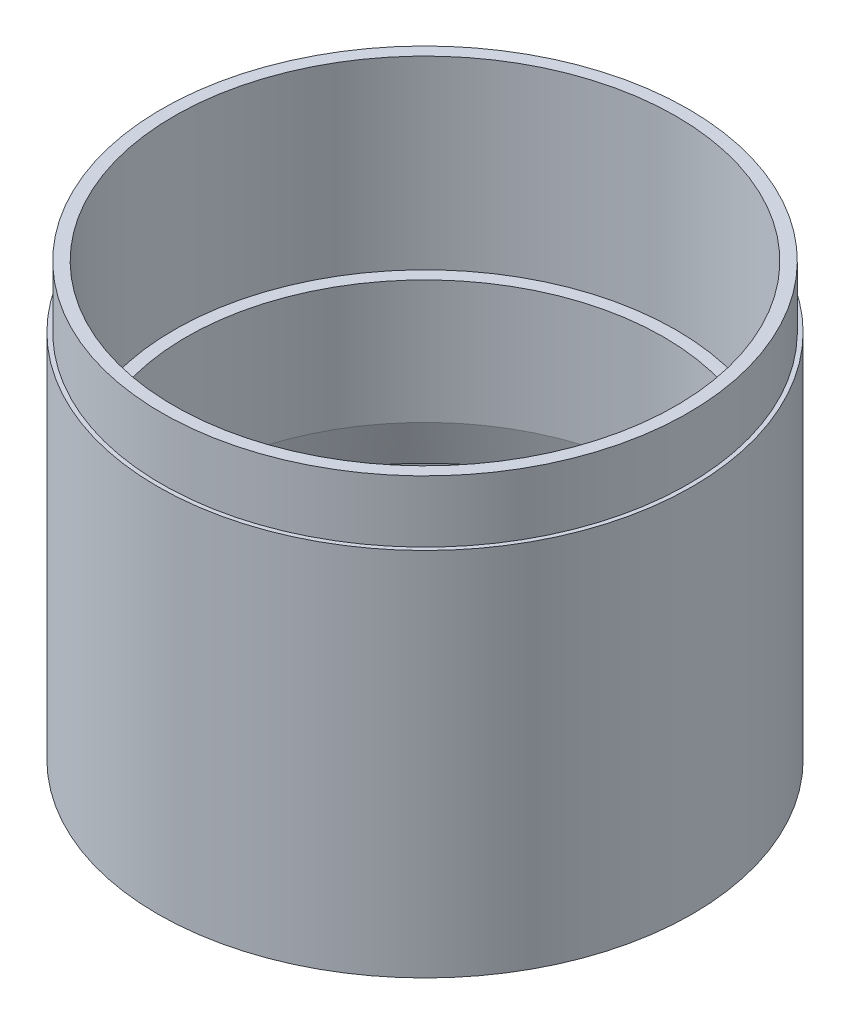
ISO-10303-21;
HEADER;
FILE_DESCRIPTION(('STEP AP214'),'2;1');
FILE_NAME('part.step','',(''),(''),'','','');
FILE_SCHEMA(('AUTOMOTIVE_DESIGN { 1 0 10303 214 1 1 1 1 }'));
ENDSEC;
DATA;
#1=APPLICATION_CONTEXT('core data for automotive mechanical design processes');
#2=APPLICATION_PROTOCOL_DEFINITION('international standard','automotive_design',2000,#1);
#3=PRODUCT_CONTEXT('',#1,'mechanical');
#4=PRODUCT('Part','Part','',(#3));
#5=PRODUCT_RELATED_PRODUCT_CATEGORY('part','',(#4));
#6=PRODUCT_DEFINITION_FORMATION('','',#4);
#7=PRODUCT_DEFINITION_CONTEXT('part definition',#1,'design');
#8=PRODUCT_DEFINITION('design','',#6,#7);
#9=PRODUCT_DEFINITION_SHAPE('','',#8);
#10=(LENGTH_UNIT() NAMED_UNIT(*) SI_UNIT(.MILLI.,.METRE.));
#11=(NAMED_UNIT(*) PLANE_ANGLE_UNIT() SI_UNIT($,.RADIAN.));
#12=(NAMED_UNIT(*) SI_UNIT($,.STERADIAN.) SOLID_ANGLE_UNIT());
#13=UNCERTAINTY_MEASURE_WITH_UNIT(LENGTH_MEASURE(1.E-05),#10,'distance_accuracy_value','');
#14=(GEOMETRIC_REPRESENTATION_CONTEXT(3) GLOBAL_UNCERTAINTY_ASSIGNED_CONTEXT((#13)) GLOBAL_UNIT_ASSIGNED_CONTEXT((#10,
#11,#12)) REPRESENTATION_CONTEXT('',''));
#15=CARTESIAN_POINT('',(0.,0.,0.));
#16=DIRECTION('',(0.,0.,1.));
#17=DIRECTION('',(1.,0.,0.));
#18=AXIS2_PLACEMENT_3D('',#15,#16,#17);
#19=CARTESIAN_POINT('',(0.,20.,0.));
#20=DIRECTION('',(0.,1.,0.));
#21=DIRECTION('',(0.,0.,1.));
#22=AXIS2_PLACEMENT_3D('',#19,#20,#21);
#23=PLANE('',#22);
#24=CARTESIAN_POINT('',(0.,20.,0.));
#25=DIRECTION('',(0.,-1.,0.));
#26=DIRECTION('',(0.,0.,-1.));
#27=AXIS2_PLACEMENT_3D('',#24,#25,#26);
#28=CIRCLE('',#27,60.);
#29=CARTESIAN_POINT('',(0.,20.,-60.));
#30=VERTEX_POINT('',#29);
#31=EDGE_CURVE('E10',#30,#30,#28,.T.);
#32=ORIENTED_EDGE('',*,*,#31,.F.);
#33=EDGE_LOOP('',(#32));
#34=FACE_BOUND('',#33,.T.);
#35=CARTESIAN_POINT('',(0.,20.,0.));
#36=DIRECTION('',(0.,-1.,0.));
#37=DIRECTION('',(0.,0.,-1.));
#38=AXIS2_PLACEMENT_3D('',#35,#36,#37);
#39=CIRCLE('',#38,62.);
#40=CARTESIAN_POINT('',(0.,20.,-62.));
#41=VERTEX_POINT('',#40);
#42=EDGE_CURVE('E88',#41,#41,#39,.T.);
#43=ORIENTED_EDGE('',*,*,#42,.T.);
#44=EDGE_LOOP('',(#43));
#45=FACE_BOUND('',#44,.T.);
#46=ADVANCED_FACE('F41',(#34,#45),#23,.F.);
#47=CARTESIAN_POINT('',(0.,20.,0.));
#48=DIRECTION('',(0.,-1.,0.));
#49=DIRECTION('',(0.,0.,-1.));
#50=AXIS2_PLACEMENT_3D('',#47,#48,#49);
#51=CONICAL_SURFACE('',#50,60.,0.19739555984988);
#52=CARTESIAN_POINT('',(0.,30.,0.));
#53=DIRECTION('',(0.,-1.,0.));
#54=DIRECTION('',(0.,0.,-1.));
#55=AXIS2_PLACEMENT_3D('',#52,#53,#54);
#56=CIRCLE('',#55,58.);
#57=CARTESIAN_POINT('',(0.,30.,-58.));
#58=VERTEX_POINT('',#57);
#59=EDGE_CURVE('E48',#58,#58,#56,.T.);
#60=ORIENTED_EDGE('',*,*,#59,.F.);
#61=EDGE_LOOP('',(#60));
#62=FACE_BOUND('',#61,.T.);
#63=ORIENTED_EDGE('',*,*,#31,.T.);
#64=EDGE_LOOP('',(#63));
#65=FACE_BOUND('',#64,.T.);
#66=ADVANCED_FACE('F106',(#62,#65),#51,.F.);
#67=CARTESIAN_POINT('',(0.,0.,0.));
#68=DIRECTION('',(0.,-1.,0.));
#69=DIRECTION('',(0.,0.,-1.));
#70=AXIS2_PLACEMENT_3D('',#67,#68,#69);
#71=CYLINDRICAL_SURFACE('',#70,58.);
#72=CARTESIAN_POINT('',(0.,60.,0.));
#73=DIRECTION('',(0.,-1.,0.));
#74=DIRECTION('',(0.,0.,-1.));
#75=AXIS2_PLACEMENT_3D('',#72,#73,#74);
#76=CIRCLE('',#75,58.);
#77=CARTESIAN_POINT('',(0.,60.,-58.));
#78=VERTEX_POINT('',#77);
#79=EDGE_CURVE('E53',#78,#78,#76,.T.);
#80=ORIENTED_EDGE('',*,*,#79,.F.);
#81=EDGE_LOOP('',(#80));
#82=FACE_BOUND('',#81,.T.);
#83=ORIENTED_EDGE('',*,*,#59,.T.);
#84=EDGE_LOOP('',(#83));
#85=FACE_BOUND('',#84,.T.);
#86=ADVANCED_FACE('F111',(#82,#85),#71,.F.);
#87=CARTESIAN_POINT('',(-1.38777878078145E-13,60.,0.));
#88=DIRECTION('',(0.,-1.,0.));
#89=DIRECTION('',(0.,0.,-1.));
#90=AXIS2_PLACEMENT_3D('',#87,#88,#89);
#91=PLANE('',#90);
#92=CARTESIAN_POINT('',(0.,60.,0.));
#93=DIRECTION('',(0.,-1.,0.));
#94=DIRECTION('',(0.,0.,-1.));
#95=AXIS2_PLACEMENT_3D('',#92,#93,#94);
#96=CIRCLE('',#95,61.);
#97=CARTESIAN_POINT('',(0.,60.,-61.));
#98=VERTEX_POINT('',#97);
#99=EDGE_CURVE('E58',#98,#98,#96,.T.);
#100=ORIENTED_EDGE('',*,*,#99,.F.);
#101=EDGE_LOOP('',(#100));
#102=FACE_BOUND('',#101,.T.);
#103=ORIENTED_EDGE('',*,*,#79,.T.);
#104=EDGE_LOOP('',(#103));
#105=FACE_BOUND('',#104,.T.);
#106=ADVANCED_FACE('F116',(#102,#105),#91,.F.);
#107=CARTESIAN_POINT('',(0.,0.,0.));
#108=DIRECTION('',(0.,-1.,0.));
#109=DIRECTION('',(0.,0.,-1.));
#110=AXIS2_PLACEMENT_3D('',#107,#108,#109);
#111=CYLINDRICAL_SURFACE('',#110,61.);
#112=CARTESIAN_POINT('',(0.,105.,0.));
#113=DIRECTION('',(0.,-1.,0.));
#114=DIRECTION('',(0.,0.,-1.));
#115=AXIS2_PLACEMENT_3D('',#112,#113,#114);
#116=CIRCLE('',#115,61.);
#117=CARTESIAN_POINT('',(0.,105.,-61.));
#118=VERTEX_POINT('',#117);
#119=EDGE_CURVE('E64',#118,#118,#116,.T.);
#120=ORIENTED_EDGE('',*,*,#119,.F.);
#121=EDGE_LOOP('',(#120));
#122=FACE_BOUND('',#121,.T.);
#123=ORIENTED_EDGE('',*,*,#99,.T.);
#124=EDGE_LOOP('',(#123));
#125=FACE_BOUND('',#124,.T.);
#126=ADVANCED_FACE('F122',(#122,#125),#111,.F.);
#127=CARTESIAN_POINT('',(0.,105.,0.));
#128=DIRECTION('',(0.,1.,0.));
#129=DIRECTION('',(0.,0.,1.));
#130=AXIS2_PLACEMENT_3D('',#127,#128,#129);
#131=PLANE('',#130);
#132=ORIENTED_EDGE('',*,*,#119,.T.);
#133=EDGE_LOOP('',(#132));
#134=FACE_BOUND('',#133,.T.);
#135=CARTESIAN_POINT('',(0.,105.,0.));
#136=DIRECTION('',(0.,-1.,0.));
#137=DIRECTION('',(0.,0.,-1.));
#138=AXIS2_PLACEMENT_3D('',#135,#136,#137);
#139=CIRCLE('',#138,64.);
#140=CARTESIAN_POINT('',(0.,105.,-64.));
#141=VERTEX_POINT('',#140);
#142=EDGE_CURVE('E68',#141,#141,#139,.T.);
#143=ORIENTED_EDGE('',*,*,#142,.F.);
#144=EDGE_LOOP('',(#143));
#145=FACE_BOUND('',#144,.T.);
#146=ADVANCED_FACE('F126',(#134,#145),#131,.T.);
#147=CARTESIAN_POINT('',(0.,0.,0.));
#148=DIRECTION('',(0.,-1.,0.));
#149=DIRECTION('',(0.,0.,-1.));
#150=AXIS2_PLACEMENT_3D('',#147,#148,#149);
#151=CYLINDRICAL_SURFACE('',#150,64.);
#152=ORIENTED_EDGE('',*,*,#142,.T.);
#153=EDGE_LOOP('',(#152));
#154=FACE_BOUND('',#153,.T.);
#155=CARTESIAN_POINT('',(0.,90.,0.));
#156=DIRECTION('',(0.,-1.,0.));
#157=DIRECTION('',(0.,0.,-1.));
#158=AXIS2_PLACEMENT_3D('',#155,#156,#157);
#159=CIRCLE('',#158,64.);
#160=CARTESIAN_POINT('',(0.,90.,-64.));
#161=VERTEX_POINT('',#160);
#162=EDGE_CURVE('E72',#161,#161,#159,.T.);
#163=ORIENTED_EDGE('',*,*,#162,.F.);
#164=EDGE_LOOP('',(#163));
#165=FACE_BOUND('',#164,.T.);
#166=ADVANCED_FACE('F130',(#154,#165),#151,.T.);
#167=CARTESIAN_POINT('',(0.,90.,0.));
#168=DIRECTION('',(0.,1.,0.));
#169=DIRECTION('',(0.,0.,1.));
#170=AXIS2_PLACEMENT_3D('',#167,#168,#169);
#171=PLANE('',#170);
#172=ORIENTED_EDGE('',*,*,#162,.T.);
#173=EDGE_LOOP('',(#172));
#174=FACE_BOUND('',#173,.T.);
#175=CARTESIAN_POINT('',(0.,90.,0.));
#176=DIRECTION('',(0.,-1.,0.));
#177=DIRECTION('',(0.,0.,-1.));
#178=AXIS2_PLACEMENT_3D('',#175,#176,#177);
#179=CIRCLE('',#178,65.);
#180=CARTESIAN_POINT('',(0.,90.,-65.));
#181=VERTEX_POINT('',#180);
#182=EDGE_CURVE('E76',#181,#181,#179,.T.);
#183=ORIENTED_EDGE('',*,*,#182,.F.);
#184=EDGE_LOOP('',(#183));
#185=FACE_BOUND('',#184,.T.);
#186=ADVANCED_FACE('F134',(#174,#185),#171,.T.);
#187=CARTESIAN_POINT('',(0.,0.,0.));
#188=DIRECTION('',(0.,-1.,0.));
#189=DIRECTION('',(0.,0.,-1.));
#190=AXIS2_PLACEMENT_3D('',#187,#188,#189);
#191=CYLINDRICAL_SURFACE('',#190,65.);
#192=ORIENTED_EDGE('',*,*,#182,.T.);
#193=EDGE_LOOP('',(#192));
#194=FACE_BOUND('',#193,.T.);
#195=CARTESIAN_POINT('',(0.,0.,0.));
#196=DIRECTION('',(0.,-1.,0.));
#197=DIRECTION('',(0.,0.,-1.));
#198=AXIS2_PLACEMENT_3D('',#195,#196,#197);
#199=CIRCLE('',#198,65.);
#200=CARTESIAN_POINT('',(0.,0.,-65.));
#201=VERTEX_POINT('',#200);
#202=EDGE_CURVE('E80',#201,#201,#199,.T.);
#203=ORIENTED_EDGE('',*,*,#202,.F.);
#204=EDGE_LOOP('',(#203));
#205=FACE_BOUND('',#204,.T.);
#206=ADVANCED_FACE('F102',(#194,#205),#191,.T.);
#207=CARTESIAN_POINT('',(0.,0.,0.));
#208=DIRECTION('',(0.,-1.,0.));
#209=DIRECTION('',(0.,0.,-1.));
#210=AXIS2_PLACEMENT_3D('',#207,#208,#209);
#211=PLANE('',#210);
#212=ORIENTED_EDGE('',*,*,#202,.T.);
#213=EDGE_LOOP('',(#212));
#214=FACE_BOUND('',#213,.T.);
#215=CARTESIAN_POINT('',(0.,0.,0.));
#216=DIRECTION('',(0.,-1.,0.));
#217=DIRECTION('',(0.,0.,-1.));
#218=AXIS2_PLACEMENT_3D('',#215,#216,#217);
#219=CIRCLE('',#218,62.);
#220=CARTESIAN_POINT('',(0.,0.,-62.));
#221=VERTEX_POINT('',#220);
#222=EDGE_CURVE('E84',#221,#221,#219,.T.);
#223=ORIENTED_EDGE('',*,*,#222,.F.);
#224=EDGE_LOOP('',(#223));
#225=FACE_BOUND('',#224,.T.);
#226=ADVANCED_FACE('F96',(#214,#225),#211,.T.);
#227=CARTESIAN_POINT('',(0.,0.,0.));
#228=DIRECTION('',(0.,-1.,0.));
#229=DIRECTION('',(0.,0.,-1.));
#230=AXIS2_PLACEMENT_3D('',#227,#228,#229);
#231=CYLINDRICAL_SURFACE('',#230,62.);
#232=ORIENTED_EDGE('',*,*,#222,.T.);
#233=EDGE_LOOP('',(#232));
#234=FACE_BOUND('',#233,.T.);
#235=ORIENTED_EDGE('',*,*,#42,.F.);
#236=EDGE_LOOP('',(#235));
#237=FACE_BOUND('',#236,.T.);
#238=ADVANCED_FACE('F94',(#234,#237),#231,.F.);
#239=CLOSED_SHELL('',(#46,#66,#86,#106,#126,#146,#166,#186,#206,#226,#238));
#240=MANIFOLD_SOLID_BREP('B2',#239);
#241=ADVANCED_BREP_SHAPE_REPRESENTATION('',(#18,#240),#14);
#242=SHAPE_DEFINITION_REPRESENTATION(#9,#241);
ENDSEC;
END-ISO-10303-21;
